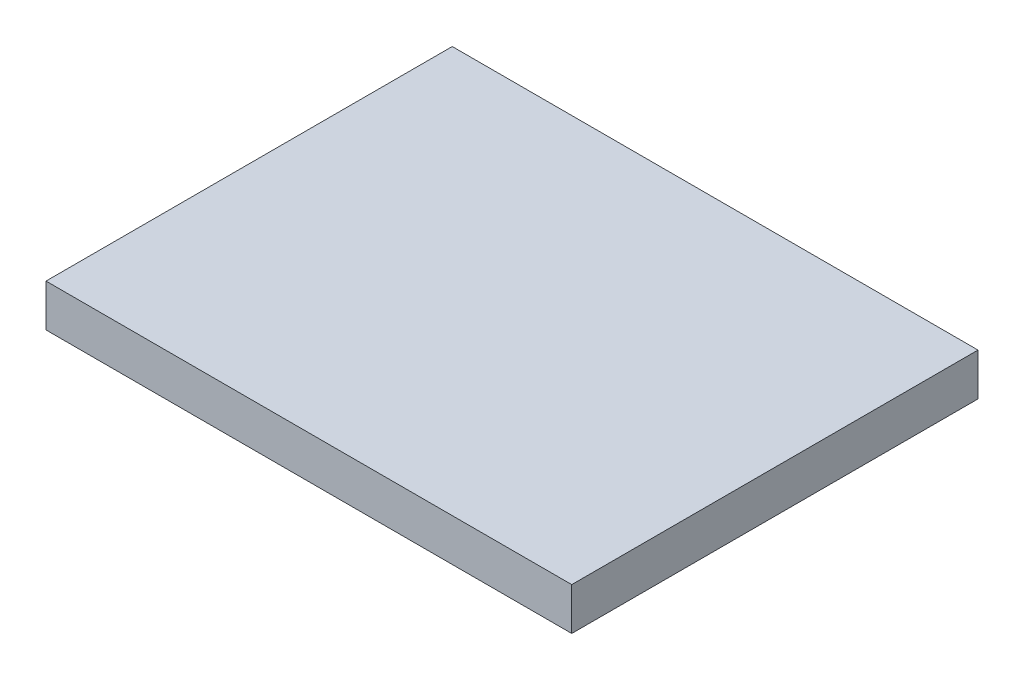
ISO-10303-21;
HEADER;
FILE_DESCRIPTION(('STEP AP214'),'2;1');
FILE_NAME('part.step','',(''),(''),'','','');
FILE_SCHEMA(('AUTOMOTIVE_DESIGN { 1 0 10303 214 1 1 1 1 }'));
ENDSEC;
DATA;
#1=APPLICATION_CONTEXT('core data for automotive mechanical design processes');
#2=APPLICATION_PROTOCOL_DEFINITION('international standard','automotive_design',2000,#1);
#3=PRODUCT_CONTEXT('',#1,'mechanical');
#4=PRODUCT('Part','Part','',(#3));
#5=PRODUCT_RELATED_PRODUCT_CATEGORY('part','',(#4));
#6=PRODUCT_DEFINITION_FORMATION('','',#4);
#7=PRODUCT_DEFINITION_CONTEXT('part definition',#1,'design');
#8=PRODUCT_DEFINITION('design','',#6,#7);
#9=PRODUCT_DEFINITION_SHAPE('','',#8);
#10=(LENGTH_UNIT() NAMED_UNIT(*) SI_UNIT(.MILLI.,.METRE.));
#11=(NAMED_UNIT(*) PLANE_ANGLE_UNIT() SI_UNIT($,.RADIAN.));
#12=(NAMED_UNIT(*) SI_UNIT($,.STERADIAN.) SOLID_ANGLE_UNIT());
#13=UNCERTAINTY_MEASURE_WITH_UNIT(LENGTH_MEASURE(1.E-05),#10,'distance_accuracy_value','');
#14=(GEOMETRIC_REPRESENTATION_CONTEXT(3) GLOBAL_UNCERTAINTY_ASSIGNED_CONTEXT((#13)) GLOBAL_UNIT_ASSIGNED_CONTEXT((#10,
#11,#12)) REPRESENTATION_CONTEXT('',''));
#15=CARTESIAN_POINT('',(0.,0.,0.));
#16=DIRECTION('',(0.,0.,1.));
#17=DIRECTION('',(1.,0.,0.));
#18=AXIS2_PLACEMENT_3D('',#15,#16,#17);
#19=CARTESIAN_POINT('',(-4.2418,2.9756,3.8862));
#20=DIRECTION('',(1.,0.,0.));
#21=DIRECTION('',(0.,-1.,0.));
#22=AXIS2_PLACEMENT_3D('',#19,#20,#21);
#23=PLANE('',#22);
#24=DIRECTION('',(0.,0.,1.));
#25=VECTOR('',#24,1.);
#26=CARTESIAN_POINT('',(-4.2418,2.9306,3.8862));
#27=LINE('',#26,#25);
#28=CARTESIAN_POINT('',(-4.2418,2.9306,3.4544));
#29=VERTEX_POINT('',#28);
#30=CARTESIAN_POINT('',(-4.2418,2.9306,3.8862));
#31=VERTEX_POINT('',#30);
#32=EDGE_CURVE('E11',#29,#31,#27,.T.);
#33=ORIENTED_EDGE('',*,*,#32,.T.);
#34=DIRECTION('',(0.,-1.,0.));
#35=VECTOR('',#34,1.);
#36=CARTESIAN_POINT('',(-4.2418,2.9756,3.8862));
#37=LINE('',#36,#35);
#38=CARTESIAN_POINT('',(-4.2418,2.9756,3.8862));
#39=VERTEX_POINT('',#38);
#40=EDGE_CURVE('E24',#39,#31,#37,.T.);
#41=ORIENTED_EDGE('',*,*,#40,.F.);
#42=DIRECTION('',(0.,0.,1.));
#43=VECTOR('',#42,1.);
#44=CARTESIAN_POINT('',(-4.2418,2.9756,3.8862));
#45=LINE('',#44,#43);
#46=CARTESIAN_POINT('',(-4.2418,2.9756,3.4544));
#47=VERTEX_POINT('',#46);
#48=EDGE_CURVE('E88',#47,#39,#45,.T.);
#49=ORIENTED_EDGE('',*,*,#48,.F.);
#50=DIRECTION('',(0.,-1.,0.));
#51=VECTOR('',#50,1.);
#52=CARTESIAN_POINT('',(-4.2418,2.9756,3.4544));
#53=LINE('',#52,#51);
#54=EDGE_CURVE('E77',#47,#29,#53,.T.);
#55=ORIENTED_EDGE('',*,*,#54,.T.);
#56=EDGE_LOOP('',(#33,#41,#49,#55));
#57=FACE_BOUND('',#56,.T.);
#58=ADVANCED_FACE('F17',(#57),#23,.F.);
#59=CARTESIAN_POINT('',(-3.683,2.9756,3.8862));
#60=DIRECTION('',(0.,0.,-1.));
#61=DIRECTION('',(0.,1.,0.));
#62=AXIS2_PLACEMENT_3D('',#59,#60,#61);
#63=PLANE('',#62);
#64=DIRECTION('',(1.,0.,0.));
#65=VECTOR('',#64,1.);
#66=CARTESIAN_POINT('',(-3.683,2.9306,3.8862));
#67=LINE('',#66,#65);
#68=CARTESIAN_POINT('',(-3.683,2.9306,3.8862));
#69=VERTEX_POINT('',#68);
#70=EDGE_CURVE('E85',#31,#69,#67,.T.);
#71=ORIENTED_EDGE('',*,*,#70,.T.);
#72=DIRECTION('',(0.,-1.,0.));
#73=VECTOR('',#72,1.);
#74=CARTESIAN_POINT('',(-3.683,2.9756,3.8862));
#75=LINE('',#74,#73);
#76=CARTESIAN_POINT('',(-3.683,2.9756,3.8862));
#77=VERTEX_POINT('',#76);
#78=EDGE_CURVE('E83',#77,#69,#75,.T.);
#79=ORIENTED_EDGE('',*,*,#78,.F.);
#80=DIRECTION('',(1.,0.,0.));
#81=VECTOR('',#80,1.);
#82=CARTESIAN_POINT('',(-3.683,2.9756,3.8862));
#83=LINE('',#82,#81);
#84=EDGE_CURVE('E72',#39,#77,#83,.T.);
#85=ORIENTED_EDGE('',*,*,#84,.F.);
#86=ORIENTED_EDGE('',*,*,#40,.T.);
#87=EDGE_LOOP('',(#71,#79,#85,#86));
#88=FACE_BOUND('',#87,.T.);
#89=ADVANCED_FACE('F90',(#88),#63,.F.);
#90=CARTESIAN_POINT('',(-3.683,2.9756,3.4544));
#91=DIRECTION('',(-1.,0.,0.));
#92=DIRECTION('',(0.,1.,0.));
#93=AXIS2_PLACEMENT_3D('',#90,#91,#92);
#94=PLANE('',#93);
#95=DIRECTION('',(0.,0.,-1.));
#96=VECTOR('',#95,1.);
#97=CARTESIAN_POINT('',(-3.683,2.9306,3.4544));
#98=LINE('',#97,#96);
#99=CARTESIAN_POINT('',(-3.683,2.9306,3.4544));
#100=VERTEX_POINT('',#99);
#101=EDGE_CURVE('E60',#69,#100,#98,.T.);
#102=ORIENTED_EDGE('',*,*,#101,.T.);
#103=DIRECTION('',(0.,-1.,0.));
#104=VECTOR('',#103,1.);
#105=CARTESIAN_POINT('',(-3.683,2.9756,3.4544));
#106=LINE('',#105,#104);
#107=CARTESIAN_POINT('',(-3.683,2.9756,3.4544));
#108=VERTEX_POINT('',#107);
#109=EDGE_CURVE('E54',#108,#100,#106,.T.);
#110=ORIENTED_EDGE('',*,*,#109,.F.);
#111=DIRECTION('',(0.,0.,-1.));
#112=VECTOR('',#111,1.);
#113=CARTESIAN_POINT('',(-3.683,2.9756,3.4544));
#114=LINE('',#113,#112);
#115=EDGE_CURVE('E58',#77,#108,#114,.T.);
#116=ORIENTED_EDGE('',*,*,#115,.F.);
#117=ORIENTED_EDGE('',*,*,#78,.T.);
#118=EDGE_LOOP('',(#102,#110,#116,#117));
#119=FACE_BOUND('',#118,.T.);
#120=ADVANCED_FACE('F56',(#119),#94,.F.);
#121=CARTESIAN_POINT('',(-4.2418,2.9756,3.4544));
#122=DIRECTION('',(0.,0.,1.));
#123=DIRECTION('',(0.,-1.,0.));
#124=AXIS2_PLACEMENT_3D('',#121,#122,#123);
#125=PLANE('',#124);
#126=DIRECTION('',(-1.,0.,0.));
#127=VECTOR('',#126,1.);
#128=CARTESIAN_POINT('',(-4.2418,2.9306,3.4544));
#129=LINE('',#128,#127);
#130=EDGE_CURVE('E73',#100,#29,#129,.T.);
#131=ORIENTED_EDGE('',*,*,#130,.T.);
#132=ORIENTED_EDGE('',*,*,#54,.F.);
#133=DIRECTION('',(-1.,0.,0.));
#134=VECTOR('',#133,1.);
#135=CARTESIAN_POINT('',(-4.2418,2.9756,3.4544));
#136=LINE('',#135,#134);
#137=EDGE_CURVE('E70',#108,#47,#136,.T.);
#138=ORIENTED_EDGE('',*,*,#137,.F.);
#139=ORIENTED_EDGE('',*,*,#109,.T.);
#140=EDGE_LOOP('',(#131,#132,#138,#139));
#141=FACE_BOUND('',#140,.T.);
#142=ADVANCED_FACE('F76',(#141),#125,.F.);
#143=CARTESIAN_POINT('',(0.,2.9756,0.));
#144=DIRECTION('',(0.,-1.,0.));
#145=DIRECTION('',(-1.,0.,0.));
#146=AXIS2_PLACEMENT_3D('',#143,#144,#145);
#147=PLANE('',#146);
#148=ORIENTED_EDGE('',*,*,#48,.T.);
#149=ORIENTED_EDGE('',*,*,#84,.T.);
#150=ORIENTED_EDGE('',*,*,#115,.T.);
#151=ORIENTED_EDGE('',*,*,#137,.T.);
#152=EDGE_LOOP('',(#148,#149,#150,#151));
#153=FACE_BOUND('',#152,.T.);
#154=ADVANCED_FACE('F69',(#153),#147,.F.);
#155=CARTESIAN_POINT('',(0.,2.9306,0.));
#156=DIRECTION('',(0.,-1.,0.));
#157=DIRECTION('',(-1.,0.,0.));
#158=AXIS2_PLACEMENT_3D('',#155,#156,#157);
#159=PLANE('',#158);
#160=ORIENTED_EDGE('',*,*,#32,.F.);
#161=ORIENTED_EDGE('',*,*,#130,.F.);
#162=ORIENTED_EDGE('',*,*,#101,.F.);
#163=ORIENTED_EDGE('',*,*,#70,.F.);
#164=EDGE_LOOP('',(#160,#161,#162,#163));
#165=FACE_BOUND('',#164,.T.);
#166=ADVANCED_FACE('F91',(#165),#159,.T.);
#167=CLOSED_SHELL('',(#58,#89,#120,#142,#154,#166));
#168=MANIFOLD_SOLID_BREP('B1',#167);
#169=ADVANCED_BREP_SHAPE_REPRESENTATION('',(#18,#168),#14);
#170=SHAPE_DEFINITION_REPRESENTATION(#9,#169);
ENDSEC;
END-ISO-10303-21;
